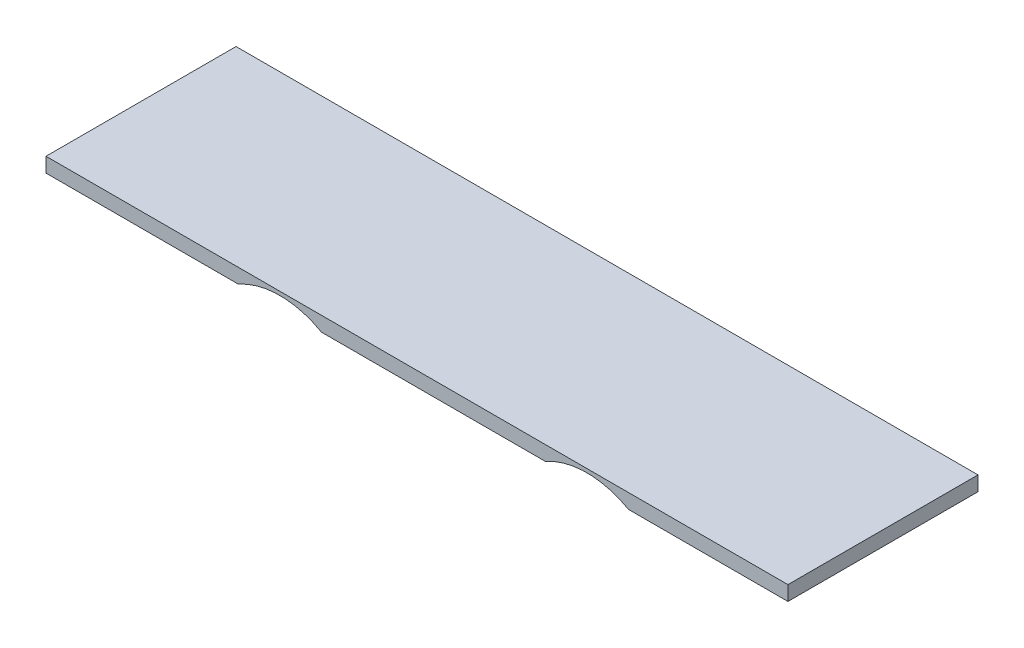
ISO-10303-21;
HEADER;
FILE_DESCRIPTION(('STEP AP214'),'2;1');
FILE_NAME('part.step','',(''),(''),'','','');
FILE_SCHEMA(('AUTOMOTIVE_DESIGN { 1 0 10303 214 1 1 1 1 }'));
ENDSEC;
DATA;
#1=APPLICATION_CONTEXT('core data for automotive mechanical design processes');
#2=APPLICATION_PROTOCOL_DEFINITION('international standard','automotive_design',2000,#1);
#3=PRODUCT_CONTEXT('',#1,'mechanical');
#4=PRODUCT('Part','Part','',(#3));
#5=PRODUCT_RELATED_PRODUCT_CATEGORY('part','',(#4));
#6=PRODUCT_DEFINITION_FORMATION('','',#4);
#7=PRODUCT_DEFINITION_CONTEXT('part definition',#1,'design');
#8=PRODUCT_DEFINITION('design','',#6,#7);
#9=PRODUCT_DEFINITION_SHAPE('','',#8);
#10=(LENGTH_UNIT() NAMED_UNIT(*) SI_UNIT(.MILLI.,.METRE.));
#11=(NAMED_UNIT(*) PLANE_ANGLE_UNIT() SI_UNIT($,.RADIAN.));
#12=(NAMED_UNIT(*) SI_UNIT($,.STERADIAN.) SOLID_ANGLE_UNIT());
#13=UNCERTAINTY_MEASURE_WITH_UNIT(LENGTH_MEASURE(1.E-05),#10,'distance_accuracy_value','');
#14=(GEOMETRIC_REPRESENTATION_CONTEXT(3) GLOBAL_UNCERTAINTY_ASSIGNED_CONTEXT((#13)) GLOBAL_UNIT_ASSIGNED_CONTEXT((#10,
#11,#12)) REPRESENTATION_CONTEXT('',''));
#15=CARTESIAN_POINT('',(0.,0.,0.));
#16=DIRECTION('',(0.,0.,1.));
#17=DIRECTION('',(1.,0.,0.));
#18=AXIS2_PLACEMENT_3D('',#15,#16,#17);
#19=CARTESIAN_POINT('',(0.,0.,26.));
#20=DIRECTION('',(1.,0.,0.));
#21=DIRECTION('',(0.,0.,-1.));
#22=AXIS2_PLACEMENT_3D('',#19,#20,#21);
#23=PLANE('',#22);
#24=DIRECTION('',(0.,-1.,0.));
#25=VECTOR('',#24,1.);
#26=CARTESIAN_POINT('',(0.,0.,0.));
#27=LINE('',#26,#25);
#28=CARTESIAN_POINT('',(0.,0.,0.));
#29=VERTEX_POINT('',#28);
#30=CARTESIAN_POINT('',(0.,-2.,0.));
#31=VERTEX_POINT('',#30);
#32=EDGE_CURVE('E129',#29,#31,#27,.T.);
#33=ORIENTED_EDGE('',*,*,#32,.T.);
#34=DIRECTION('',(0.,0.,-1.));
#35=VECTOR('',#34,1.);
#36=CARTESIAN_POINT('',(0.,-2.,26.));
#37=LINE('',#36,#35);
#38=CARTESIAN_POINT('',(0.,-2.,26.));
#39=VERTEX_POINT('',#38);
#40=EDGE_CURVE('E11',#39,#31,#37,.T.);
#41=ORIENTED_EDGE('',*,*,#40,.F.);
#42=DIRECTION('',(0.,-1.,0.));
#43=VECTOR('',#42,1.);
#44=CARTESIAN_POINT('',(0.,0.,26.));
#45=LINE('',#44,#43);
#46=CARTESIAN_POINT('',(0.,0.,26.));
#47=VERTEX_POINT('',#46);
#48=EDGE_CURVE('E143',#47,#39,#45,.T.);
#49=ORIENTED_EDGE('',*,*,#48,.F.);
#50=DIRECTION('',(0.,0.,-1.));
#51=VECTOR('',#50,1.);
#52=CARTESIAN_POINT('',(0.,0.,26.));
#53=LINE('',#52,#51);
#54=EDGE_CURVE('E125',#47,#29,#53,.T.);
#55=ORIENTED_EDGE('',*,*,#54,.T.);
#56=EDGE_LOOP('',(#33,#41,#49,#55));
#57=FACE_BOUND('',#56,.T.);
#58=ADVANCED_FACE('F33',(#57),#23,.F.);
#59=CARTESIAN_POINT('',(0.,-2.,26.));
#60=DIRECTION('',(0.,1.,0.));
#61=DIRECTION('',(-1.,0.,0.));
#62=AXIS2_PLACEMENT_3D('',#59,#60,#61);
#63=PLANE('',#62);
#64=DIRECTION('',(1.,0.,0.));
#65=VECTOR('',#64,1.);
#66=CARTESIAN_POINT('',(0.,-2.,0.));
#67=LINE('',#66,#65);
#68=CARTESIAN_POINT('',(26.3210916541997,-2.00000000000001,0.));
#69=VERTEX_POINT('',#68);
#70=EDGE_CURVE('E132',#31,#69,#67,.T.);
#71=ORIENTED_EDGE('',*,*,#70,.T.);
#72=DIRECTION('',(0.,0.,-1.));
#73=VECTOR('',#72,1.);
#74=CARTESIAN_POINT('',(26.3210916541997,-2.00000000000001,26.));
#75=LINE('',#74,#73);
#76=CARTESIAN_POINT('',(26.3210916541997,-2.00000000000001,26.));
#77=VERTEX_POINT('',#76);
#78=EDGE_CURVE('E41',#77,#69,#75,.T.);
#79=ORIENTED_EDGE('',*,*,#78,.F.);
#80=DIRECTION('',(1.,0.,0.));
#81=VECTOR('',#80,1.);
#82=CARTESIAN_POINT('',(0.,-2.,26.));
#83=LINE('',#82,#81);
#84=EDGE_CURVE('E92',#39,#77,#83,.T.);
#85=ORIENTED_EDGE('',*,*,#84,.F.);
#86=ORIENTED_EDGE('',*,*,#40,.T.);
#87=EDGE_LOOP('',(#71,#79,#85,#86));
#88=FACE_BOUND('',#87,.T.);
#89=ADVANCED_FACE('F178',(#88),#63,.F.);
#90=CARTESIAN_POINT('',(32.,-12.,26.));
#91=DIRECTION('',(0.,0.,-1.));
#92=DIRECTION('',(-1.,0.,0.));
#93=AXIS2_PLACEMENT_3D('',#90,#91,#92);
#94=CYLINDRICAL_SURFACE('',#93,11.5);
#95=CARTESIAN_POINT('',(32.,-12.,0.));
#96=DIRECTION('',(0.,0.,-1.));
#97=DIRECTION('',(1.,0.,0.));
#98=AXIS2_PLACEMENT_3D('',#95,#96,#97);
#99=CIRCLE('',#98,11.5);
#100=CARTESIAN_POINT('',(37.6789083458003,-2.,0.));
#101=VERTEX_POINT('',#100);
#102=EDGE_CURVE('E134',#69,#101,#99,.T.);
#103=ORIENTED_EDGE('',*,*,#102,.T.);
#104=DIRECTION('',(0.,0.,-1.));
#105=VECTOR('',#104,1.);
#106=CARTESIAN_POINT('',(37.6789083458003,-2.,26.));
#107=LINE('',#106,#105);
#108=CARTESIAN_POINT('',(37.6789083458003,-2.,26.));
#109=VERTEX_POINT('',#108);
#110=EDGE_CURVE('E150',#109,#101,#107,.T.);
#111=ORIENTED_EDGE('',*,*,#110,.F.);
#112=CARTESIAN_POINT('',(32.,-12.,26.));
#113=DIRECTION('',(0.,0.,-1.));
#114=DIRECTION('',(1.,0.,0.));
#115=AXIS2_PLACEMENT_3D('',#112,#113,#114);
#116=CIRCLE('',#115,11.5);
#117=EDGE_CURVE('E158',#77,#109,#116,.T.);
#118=ORIENTED_EDGE('',*,*,#117,.F.);
#119=ORIENTED_EDGE('',*,*,#78,.T.);
#120=EDGE_LOOP('',(#103,#111,#118,#119));
#121=FACE_BOUND('',#120,.T.);
#122=ADVANCED_FACE('F156',(#121),#94,.F.);
#123=CARTESIAN_POINT('',(37.6789083458003,-2.,26.));
#124=DIRECTION('',(0.,1.,0.));
#125=DIRECTION('',(-1.,0.,0.));
#126=AXIS2_PLACEMENT_3D('',#123,#124,#125);
#127=PLANE('',#126);
#128=DIRECTION('',(1.,0.,0.));
#129=VECTOR('',#128,1.);
#130=CARTESIAN_POINT('',(37.6789083458003,-2.,0.));
#131=LINE('',#130,#129);
#132=CARTESIAN_POINT('',(68.3210916541997,-2.,0.));
#133=VERTEX_POINT('',#132);
#134=EDGE_CURVE('E136',#101,#133,#131,.T.);
#135=ORIENTED_EDGE('',*,*,#134,.T.);
#136=DIRECTION('',(0.,0.,-1.));
#137=VECTOR('',#136,1.);
#138=CARTESIAN_POINT('',(68.3210916541997,-2.,26.));
#139=LINE('',#138,#137);
#140=CARTESIAN_POINT('',(68.3210916541997,-2.,26.));
#141=VERTEX_POINT('',#140);
#142=EDGE_CURVE('E147',#141,#133,#139,.T.);
#143=ORIENTED_EDGE('',*,*,#142,.F.);
#144=DIRECTION('',(1.,0.,0.));
#145=VECTOR('',#144,1.);
#146=CARTESIAN_POINT('',(37.6789083458003,-2.,26.));
#147=LINE('',#146,#145);
#148=EDGE_CURVE('E170',#109,#141,#147,.T.);
#149=ORIENTED_EDGE('',*,*,#148,.F.);
#150=ORIENTED_EDGE('',*,*,#110,.T.);
#151=EDGE_LOOP('',(#135,#143,#149,#150));
#152=FACE_BOUND('',#151,.T.);
#153=ADVANCED_FACE('F166',(#152),#127,.F.);
#154=CARTESIAN_POINT('',(74.,-12.,26.));
#155=DIRECTION('',(0.,0.,-1.));
#156=DIRECTION('',(-1.,0.,0.));
#157=AXIS2_PLACEMENT_3D('',#154,#155,#156);
#158=CYLINDRICAL_SURFACE('',#157,11.5);
#159=CARTESIAN_POINT('',(74.,-12.,0.));
#160=DIRECTION('',(0.,0.,-1.));
#161=DIRECTION('',(1.,0.,0.));
#162=AXIS2_PLACEMENT_3D('',#159,#160,#161);
#163=CIRCLE('',#162,11.5);
#164=CARTESIAN_POINT('',(79.6789083458003,-2.,0.));
#165=VERTEX_POINT('',#164);
#166=EDGE_CURVE('E138',#133,#165,#163,.T.);
#167=ORIENTED_EDGE('',*,*,#166,.T.);
#168=DIRECTION('',(0.,0.,-1.));
#169=VECTOR('',#168,1.);
#170=CARTESIAN_POINT('',(79.6789083458003,-2.,26.));
#171=LINE('',#170,#169);
#172=CARTESIAN_POINT('',(79.6789083458003,-2.,26.));
#173=VERTEX_POINT('',#172);
#174=EDGE_CURVE('E120',#173,#165,#171,.T.);
#175=ORIENTED_EDGE('',*,*,#174,.F.);
#176=CARTESIAN_POINT('',(74.,-12.,26.));
#177=DIRECTION('',(0.,0.,-1.));
#178=DIRECTION('',(1.,0.,0.));
#179=AXIS2_PLACEMENT_3D('',#176,#177,#178);
#180=CIRCLE('',#179,11.5);
#181=EDGE_CURVE('E111',#141,#173,#180,.T.);
#182=ORIENTED_EDGE('',*,*,#181,.F.);
#183=ORIENTED_EDGE('',*,*,#142,.T.);
#184=EDGE_LOOP('',(#167,#175,#182,#183));
#185=FACE_BOUND('',#184,.T.);
#186=ADVANCED_FACE('F169',(#185),#158,.F.);
#187=CARTESIAN_POINT('',(79.6789083458003,-2.,26.));
#188=DIRECTION('',(0.,1.,0.));
#189=DIRECTION('',(-1.,0.,0.));
#190=AXIS2_PLACEMENT_3D('',#187,#188,#189);
#191=PLANE('',#190);
#192=DIRECTION('',(1.,0.,0.));
#193=VECTOR('',#192,1.);
#194=CARTESIAN_POINT('',(79.6789083458003,-2.,0.));
#195=LINE('',#194,#193);
#196=CARTESIAN_POINT('',(101.5,-2.,0.));
#197=VERTEX_POINT('',#196);
#198=EDGE_CURVE('E119',#165,#197,#195,.T.);
#199=ORIENTED_EDGE('',*,*,#198,.T.);
#200=DIRECTION('',(0.,0.,-1.));
#201=VECTOR('',#200,1.);
#202=CARTESIAN_POINT('',(101.5,-2.,26.));
#203=LINE('',#202,#201);
#204=CARTESIAN_POINT('',(101.5,-2.,26.));
#205=VERTEX_POINT('',#204);
#206=EDGE_CURVE('E116',#205,#197,#203,.T.);
#207=ORIENTED_EDGE('',*,*,#206,.F.);
#208=DIRECTION('',(1.,0.,0.));
#209=VECTOR('',#208,1.);
#210=CARTESIAN_POINT('',(79.6789083458003,-2.,26.));
#211=LINE('',#210,#209);
#212=EDGE_CURVE('E105',#173,#205,#211,.T.);
#213=ORIENTED_EDGE('',*,*,#212,.F.);
#214=ORIENTED_EDGE('',*,*,#174,.T.);
#215=EDGE_LOOP('',(#199,#207,#213,#214));
#216=FACE_BOUND('',#215,.T.);
#217=ADVANCED_FACE('F117',(#216),#191,.F.);
#218=CARTESIAN_POINT('',(101.5,-2.,26.));
#219=DIRECTION('',(-1.,0.,0.));
#220=DIRECTION('',(0.,0.,1.));
#221=AXIS2_PLACEMENT_3D('',#218,#219,#220);
#222=PLANE('',#221);
#223=DIRECTION('',(0.,1.,0.));
#224=VECTOR('',#223,1.);
#225=CARTESIAN_POINT('',(101.5,-2.,0.));
#226=LINE('',#225,#224);
#227=CARTESIAN_POINT('',(101.5,0.,0.));
#228=VERTEX_POINT('',#227);
#229=EDGE_CURVE('E78',#197,#228,#226,.T.);
#230=ORIENTED_EDGE('',*,*,#229,.T.);
#231=DIRECTION('',(0.,0.,-1.));
#232=VECTOR('',#231,1.);
#233=CARTESIAN_POINT('',(101.5,0.,26.));
#234=LINE('',#233,#232);
#235=CARTESIAN_POINT('',(101.5,0.,26.));
#236=VERTEX_POINT('',#235);
#237=EDGE_CURVE('E121',#236,#228,#234,.T.);
#238=ORIENTED_EDGE('',*,*,#237,.F.);
#239=DIRECTION('',(0.,1.,0.));
#240=VECTOR('',#239,1.);
#241=CARTESIAN_POINT('',(101.5,-2.,26.));
#242=LINE('',#241,#240);
#243=EDGE_CURVE('E109',#205,#236,#242,.T.);
#244=ORIENTED_EDGE('',*,*,#243,.F.);
#245=ORIENTED_EDGE('',*,*,#206,.T.);
#246=EDGE_LOOP('',(#230,#238,#244,#245));
#247=FACE_BOUND('',#246,.T.);
#248=ADVANCED_FACE('F123',(#247),#222,.F.);
#249=CARTESIAN_POINT('',(0.,0.,26.));
#250=DIRECTION('',(0.,-1.,0.));
#251=DIRECTION('',(0.,0.,-1.));
#252=AXIS2_PLACEMENT_3D('',#249,#250,#251);
#253=PLANE('',#252);
#254=DIRECTION('',(-1.,0.,0.));
#255=VECTOR('',#254,1.);
#256=CARTESIAN_POINT('',(0.,0.,0.));
#257=LINE('',#256,#255);
#258=EDGE_CURVE('E84',#228,#29,#257,.T.);
#259=ORIENTED_EDGE('',*,*,#258,.T.);
#260=ORIENTED_EDGE('',*,*,#54,.F.);
#261=DIRECTION('',(-1.,0.,0.));
#262=VECTOR('',#261,1.);
#263=CARTESIAN_POINT('',(0.,0.,26.));
#264=LINE('',#263,#262);
#265=EDGE_CURVE('E49',#236,#47,#264,.T.);
#266=ORIENTED_EDGE('',*,*,#265,.F.);
#267=ORIENTED_EDGE('',*,*,#237,.T.);
#268=EDGE_LOOP('',(#259,#260,#266,#267));
#269=FACE_BOUND('',#268,.T.);
#270=ADVANCED_FACE('F194',(#269),#253,.F.);
#271=CARTESIAN_POINT('',(32.,-12.,26.));
#272=DIRECTION('',(0.,0.,1.));
#273=DIRECTION('',(1.,0.,0.));
#274=AXIS2_PLACEMENT_3D('',#271,#272,#273);
#275=PLANE('',#274);
#276=ORIENTED_EDGE('',*,*,#48,.T.);
#277=ORIENTED_EDGE('',*,*,#84,.T.);
#278=ORIENTED_EDGE('',*,*,#117,.T.);
#279=ORIENTED_EDGE('',*,*,#148,.T.);
#280=ORIENTED_EDGE('',*,*,#181,.T.);
#281=ORIENTED_EDGE('',*,*,#212,.T.);
#282=ORIENTED_EDGE('',*,*,#243,.T.);
#283=ORIENTED_EDGE('',*,*,#265,.T.);
#284=EDGE_LOOP('',(#276,#277,#278,#279,#280,#281,#282,#283));
#285=FACE_BOUND('',#284,.T.);
#286=ADVANCED_FACE('F107',(#285),#275,.T.);
#287=CARTESIAN_POINT('',(32.,-12.,0.));
#288=DIRECTION('',(0.,0.,1.));
#289=DIRECTION('',(1.,0.,0.));
#290=AXIS2_PLACEMENT_3D('',#287,#288,#289);
#291=PLANE('',#290);
#292=ORIENTED_EDGE('',*,*,#32,.F.);
#293=ORIENTED_EDGE('',*,*,#258,.F.);
#294=ORIENTED_EDGE('',*,*,#229,.F.);
#295=ORIENTED_EDGE('',*,*,#198,.F.);
#296=ORIENTED_EDGE('',*,*,#166,.F.);
#297=ORIENTED_EDGE('',*,*,#134,.F.);
#298=ORIENTED_EDGE('',*,*,#102,.F.);
#299=ORIENTED_EDGE('',*,*,#70,.F.);
#300=EDGE_LOOP('',(#292,#293,#294,#295,#296,#297,#298,#299));
#301=FACE_BOUND('',#300,.T.);
#302=ADVANCED_FACE('F162',(#301),#291,.F.);
#303=CLOSED_SHELL('',(#58,#89,#122,#153,#186,#217,#248,#270,#286,#302));
#304=MANIFOLD_SOLID_BREP('B2',#303);
#305=ADVANCED_BREP_SHAPE_REPRESENTATION('',(#18,#304),#14);
#306=SHAPE_DEFINITION_REPRESENTATION(#9,#305);
ENDSEC;
END-ISO-10303-21;
